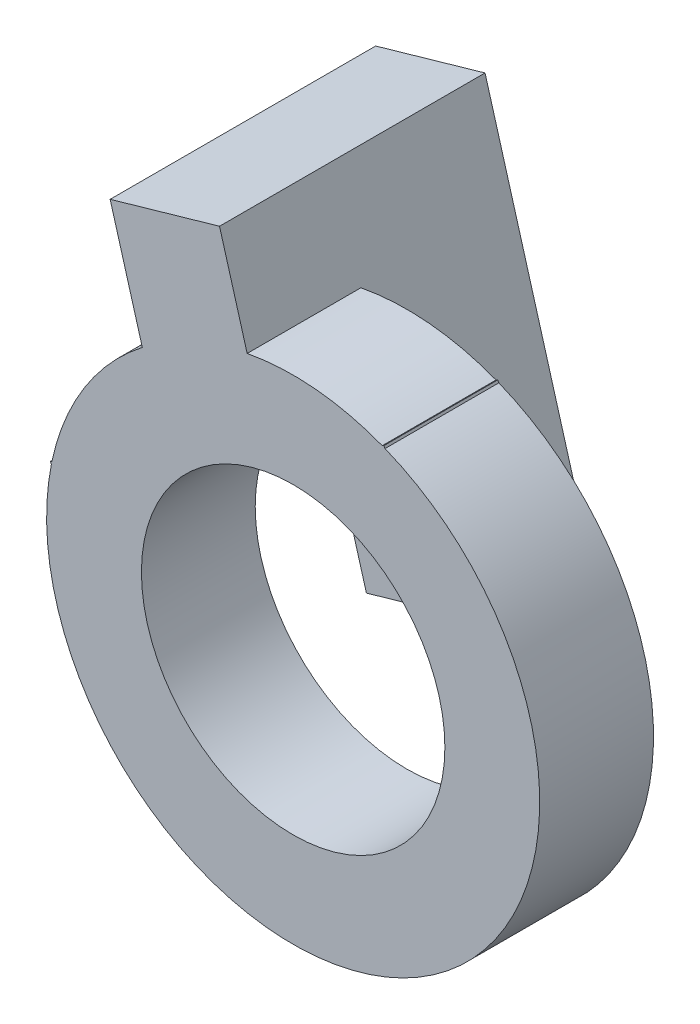
ISO-10303-21;
HEADER;
FILE_DESCRIPTION(('STEP AP214'),'2;1');
FILE_NAME('part.step','',(''),(''),'','','');
FILE_SCHEMA(('AUTOMOTIVE_DESIGN { 1 0 10303 214 1 1 1 1 }'));
ENDSEC;
DATA;
#1=APPLICATION_CONTEXT('core data for automotive mechanical design processes');
#2=APPLICATION_PROTOCOL_DEFINITION('international standard','automotive_design',2000,#1);
#3=PRODUCT_CONTEXT('',#1,'mechanical');
#4=PRODUCT('Part','Part','',(#3));
#5=PRODUCT_RELATED_PRODUCT_CATEGORY('part','',(#4));
#6=PRODUCT_DEFINITION_FORMATION('','',#4);
#7=PRODUCT_DEFINITION_CONTEXT('part definition',#1,'design');
#8=PRODUCT_DEFINITION('design','',#6,#7);
#9=PRODUCT_DEFINITION_SHAPE('','',#8);
#10=(LENGTH_UNIT() NAMED_UNIT(*) SI_UNIT(.MILLI.,.METRE.));
#11=(NAMED_UNIT(*) PLANE_ANGLE_UNIT() SI_UNIT($,.RADIAN.));
#12=(NAMED_UNIT(*) SI_UNIT($,.STERADIAN.) SOLID_ANGLE_UNIT());
#13=UNCERTAINTY_MEASURE_WITH_UNIT(LENGTH_MEASURE(1.E-05),#10,'distance_accuracy_value','');
#14=(GEOMETRIC_REPRESENTATION_CONTEXT(3) GLOBAL_UNCERTAINTY_ASSIGNED_CONTEXT((#13)) GLOBAL_UNIT_ASSIGNED_CONTEXT((#10,
#11,#12)) REPRESENTATION_CONTEXT('',''));
#15=CARTESIAN_POINT('',(0.,0.,0.));
#16=DIRECTION('',(0.,0.,1.));
#17=DIRECTION('',(1.,0.,0.));
#18=AXIS2_PLACEMENT_3D('',#15,#16,#17);
#19=CARTESIAN_POINT('',(51.308053389424,13.594933056809,57.5));
#20=DIRECTION('',(0.4757054700283,-0.879604630379555,0.));
#21=DIRECTION('',(0.,0.,-1.));
#22=AXIS2_PLACEMENT_3D('',#19,#20,#21);
#23=PLANE('',#22);
#24=DIRECTION('',(0.,0.,1.));
#25=VECTOR('',#24,1.);
#26=CARTESIAN_POINT('',(60.104099693219,18.351987757093,57.5));
#27=LINE('',#26,#25);
#28=CARTESIAN_POINT('',(60.104099693219,18.351987757093,57.5));
#29=VERTEX_POINT('',#28);
#30=CARTESIAN_POINT('',(60.104099693219,18.351987757093,60.5));
#31=VERTEX_POINT('',#30);
#32=EDGE_CURVE('E24',#29,#31,#27,.T.);
#33=ORIENTED_EDGE('',*,*,#32,.F.);
#34=DIRECTION('',(0.879604630379555,0.4757054700283,0.));
#35=VECTOR('',#34,1.);
#36=CARTESIAN_POINT('',(51.308053389424,13.594933056809,57.5));
#37=LINE('',#36,#35);
#38=CARTESIAN_POINT('',(60.059190325897,18.327699990803,57.5));
#39=VERTEX_POINT('',#38);
#40=EDGE_CURVE('E271',#39,#29,#37,.T.);
#41=ORIENTED_EDGE('',*,*,#40,.F.);
#42=DIRECTION('',(0.,0.,1.));
#43=VECTOR('',#42,1.);
#44=CARTESIAN_POINT('',(60.059190325897,18.327699990803,57.5));
#45=LINE('',#44,#43);
#46=CARTESIAN_POINT('',(60.059190325897,18.327699990803,60.5));
#47=VERTEX_POINT('',#46);
#48=EDGE_CURVE('E9',#39,#47,#45,.T.);
#49=ORIENTED_EDGE('',*,*,#48,.T.);
#50=DIRECTION('',(0.879604630379555,0.4757054700283,0.));
#51=VECTOR('',#50,1.);
#52=CARTESIAN_POINT('',(51.308053389424,13.594933056809,60.5));
#53=LINE('',#52,#51);
#54=EDGE_CURVE('E206',#47,#31,#53,.T.);
#55=ORIENTED_EDGE('',*,*,#54,.T.);
#56=EDGE_LOOP('',(#33,#41,#49,#55));
#57=FACE_BOUND('',#56,.T.);
#58=ADVANCED_FACE('F15',(#57),#23,.F.);
#59=CARTESIAN_POINT('',(57.710708443295,12.266789758248,57.5));
#60=DIRECTION('',(0.,0.,1.));
#61=DIRECTION('',(1.,0.,0.));
#62=AXIS2_PLACEMENT_3D('',#59,#60,#61);
#63=CYLINDRICAL_SURFACE('',#62,6.5);
#64=CARTESIAN_POINT('',(57.710708443295,12.266789758248,60.5));
#65=DIRECTION('',(0.,0.,1.));
#66=DIRECTION('',(1.,0.,0.));
#67=AXIS2_PLACEMENT_3D('',#64,#65,#66);
#68=CIRCLE('',#67,6.5);
#69=CARTESIAN_POINT('',(56.498263252176,18.652709947111,60.5));
#70=VERTEX_POINT('',#69);
#71=EDGE_CURVE('E211',#47,#70,#68,.T.);
#72=ORIENTED_EDGE('',*,*,#71,.F.);
#73=ORIENTED_EDGE('',*,*,#48,.F.);
#74=CARTESIAN_POINT('',(57.710708443295,12.266789758248,57.5));
#75=DIRECTION('',(0.,0.,1.));
#76=DIRECTION('',(1.,0.,0.));
#77=AXIS2_PLACEMENT_3D('',#74,#75,#76);
#78=CIRCLE('',#77,6.5);
#79=CARTESIAN_POINT('',(56.498263252177,18.652709947111,57.5));
#80=VERTEX_POINT('',#79);
#81=EDGE_CURVE('E270',#39,#80,#78,.T.);
#82=ORIENTED_EDGE('',*,*,#81,.T.);
#83=DIRECTION('',(0.,0.,1.));
#84=VECTOR('',#83,1.);
#85=CARTESIAN_POINT('',(56.498263252177,18.652709947111,57.5));
#86=LINE('',#85,#84);
#87=EDGE_CURVE('E190',#80,#70,#86,.T.);
#88=ORIENTED_EDGE('',*,*,#87,.T.);
#89=EDGE_LOOP('',(#72,#73,#82,#88));
#90=FACE_BOUND('',#89,.T.);
#91=ADVANCED_FACE('F17',(#90),#63,.T.);
#92=CARTESIAN_POINT('',(60.104099693219,18.351987757093,57.5));
#93=DIRECTION('',(0.879604630379555,0.4757054700283,0.));
#94=DIRECTION('',(0.,0.,-1.));
#95=AXIS2_PLACEMENT_3D('',#92,#93,#94);
#96=PLANE('',#95);
#97=DIRECTION('',(0.4757054700283,-0.879604630379555,0.));
#98=VECTOR('',#97,1.);
#99=CARTESIAN_POINT('',(60.104099693219,18.351987757093,57.5));
#100=LINE('',#99,#98);
#101=CARTESIAN_POINT('',(60.132978390663,18.298589514712,57.5));
#102=VERTEX_POINT('',#101);
#103=EDGE_CURVE('E203',#29,#102,#100,.T.);
#104=ORIENTED_EDGE('',*,*,#103,.F.);
#105=ORIENTED_EDGE('',*,*,#32,.T.);
#106=DIRECTION('',(0.4757054700283,-0.879604630379555,0.));
#107=VECTOR('',#106,1.);
#108=CARTESIAN_POINT('',(60.104099693219,18.351987757093,60.5));
#109=LINE('',#108,#107);
#110=CARTESIAN_POINT('',(60.132978390663,18.298589514712,60.5));
#111=VERTEX_POINT('',#110);
#112=EDGE_CURVE('E196',#31,#111,#109,.T.);
#113=ORIENTED_EDGE('',*,*,#112,.T.);
#114=DIRECTION('',(0.,0.,1.));
#115=VECTOR('',#114,1.);
#116=CARTESIAN_POINT('',(60.132978390663,18.298589514712,57.5));
#117=LINE('',#116,#115);
#118=EDGE_CURVE('E173',#102,#111,#117,.T.);
#119=ORIENTED_EDGE('',*,*,#118,.F.);
#120=EDGE_LOOP('',(#104,#105,#113,#119));
#121=FACE_BOUND('',#120,.T.);
#122=ADVANCED_FACE('F198',(#121),#96,.T.);
#123=CARTESIAN_POINT('',(58.526155864314,11.580607960985,53.5));
#124=DIRECTION('',(0.961261695938294,0.275637355817084,0.));
#125=DIRECTION('',(0.,0.,-1.));
#126=AXIS2_PLACEMENT_3D('',#123,#124,#125);
#127=PLANE('',#126);
#128=DIRECTION('',(0.,0.,1.));
#129=VECTOR('',#128,1.);
#130=CARTESIAN_POINT('',(58.526155864314,11.580607960985,53.5));
#131=LINE('',#130,#129);
#132=CARTESIAN_POINT('',(58.526155864314,11.580607960985,53.5));
#133=VERTEX_POINT('',#132);
#134=CARTESIAN_POINT('',(58.526155864314,11.580607960985,56.5));
#135=VERTEX_POINT('',#134);
#136=EDGE_CURVE('E153',#133,#135,#131,.T.);
#137=ORIENTED_EDGE('',*,*,#136,.F.);
#138=DIRECTION('',(-0.275637355817084,0.961261695938294,0.));
#139=VECTOR('',#138,1.);
#140=CARTESIAN_POINT('',(58.526155864314,11.580607960985,53.5));
#141=LINE('',#140,#139);
#142=CARTESIAN_POINT('',(55.769782306144,21.193224920368,53.5));
#143=VERTEX_POINT('',#142);
#144=EDGE_CURVE('E38',#133,#143,#141,.T.);
#145=ORIENTED_EDGE('',*,*,#144,.T.);
#146=DIRECTION('',(0.,0.,1.));
#147=VECTOR('',#146,1.);
#148=CARTESIAN_POINT('',(55.769782306144,21.193224920368,53.5));
#149=LINE('',#148,#147);
#150=CARTESIAN_POINT('',(55.769782306144,21.193224920368,60.5));
#151=VERTEX_POINT('',#150);
#152=EDGE_CURVE('E182',#143,#151,#149,.T.);
#153=ORIENTED_EDGE('',*,*,#152,.T.);
#154=DIRECTION('',(-0.275637355817084,0.961261695938294,0.));
#155=VECTOR('',#154,1.);
#156=CARTESIAN_POINT('',(58.526155864314,11.580607960985,60.5));
#157=LINE('',#156,#155);
#158=EDGE_CURVE('E235',#70,#151,#157,.T.);
#159=ORIENTED_EDGE('',*,*,#158,.F.);
#160=ORIENTED_EDGE('',*,*,#87,.F.);
#161=DIRECTION('',(-0.275637355817084,0.961261695938294,0.));
#162=VECTOR('',#161,1.);
#163=CARTESIAN_POINT('',(57.1920960519,16.233027419747,57.5));
#164=LINE('',#163,#162);
#165=CARTESIAN_POINT('',(57.1920960519,16.233027419747,57.5));
#166=VERTEX_POINT('',#165);
#167=EDGE_CURVE('E157',#166,#80,#164,.T.);
#168=ORIENTED_EDGE('',*,*,#167,.F.);
#169=DIRECTION('',(0.,0.,1.));
#170=VECTOR('',#169,1.);
#171=CARTESIAN_POINT('',(57.1920960519,16.233027419747,56.5));
#172=LINE('',#171,#170);
#173=CARTESIAN_POINT('',(57.1920960519,16.233027419747,56.5));
#174=VERTEX_POINT('',#173);
#175=EDGE_CURVE('E156',#174,#166,#172,.T.);
#176=ORIENTED_EDGE('',*,*,#175,.F.);
#177=DIRECTION('',(0.275637355817084,-0.961261695938294,0.));
#178=VECTOR('',#177,1.);
#179=CARTESIAN_POINT('',(58.404273429003,12.005662526339,56.5));
#180=LINE('',#179,#178);
#181=EDGE_CURVE('E142',#174,#135,#180,.T.);
#182=ORIENTED_EDGE('',*,*,#181,.T.);
#183=EDGE_LOOP('',(#137,#145,#153,#159,#160,#168,#176,#182));
#184=FACE_BOUND('',#183,.T.);
#185=ADVANCED_FACE('F160',(#184),#127,.T.);
#186=CARTESIAN_POINT('',(55.642370776499,10.753695893534,53.5));
#187=DIRECTION('',(0.,0.,1.));
#188=DIRECTION('',(1.,0.,0.));
#189=AXIS2_PLACEMENT_3D('',#186,#187,#188);
#190=PLANE('',#189);
#191=DIRECTION('',(0.961261695938294,0.275637355817084,0.));
#192=VECTOR('',#191,1.);
#193=CARTESIAN_POINT('',(52.885997218329,20.366312852917,53.5));
#194=LINE('',#193,#192);
#195=CARTESIAN_POINT('',(52.885997218329,20.366312852917,53.5));
#196=VERTEX_POINT('',#195);
#197=EDGE_CURVE('E155',#196,#143,#194,.T.);
#198=ORIENTED_EDGE('',*,*,#197,.T.);
#199=ORIENTED_EDGE('',*,*,#144,.F.);
#200=DIRECTION('',(0.961261695938294,0.275637355817084,0.));
#201=VECTOR('',#200,1.);
#202=CARTESIAN_POINT('',(55.642370776499,10.753695893534,53.5));
#203=LINE('',#202,#201);
#204=CARTESIAN_POINT('',(55.642370776499,10.753695893534,53.5));
#205=VERTEX_POINT('',#204);
#206=EDGE_CURVE('E176',#205,#133,#203,.T.);
#207=ORIENTED_EDGE('',*,*,#206,.F.);
#208=DIRECTION('',(-0.275637355817084,0.961261695938294,0.));
#209=VECTOR('',#208,1.);
#210=CARTESIAN_POINT('',(55.642370776499,10.753695893534,53.5));
#211=LINE('',#210,#209);
#212=EDGE_CURVE('E232',#205,#196,#211,.T.);
#213=ORIENTED_EDGE('',*,*,#212,.T.);
#214=EDGE_LOOP('',(#198,#199,#207,#213));
#215=FACE_BOUND('',#214,.T.);
#216=ADVANCED_FACE('F301',(#215),#190,.F.);
#217=CARTESIAN_POINT('',(52.885997218329,20.366312852917,53.5));
#218=DIRECTION('',(-0.275637355817084,0.961261695938294,0.));
#219=DIRECTION('',(0.,0.,1.));
#220=AXIS2_PLACEMENT_3D('',#217,#218,#219);
#221=PLANE('',#220);
#222=ORIENTED_EDGE('',*,*,#197,.F.);
#223=DIRECTION('',(0.,0.,1.));
#224=VECTOR('',#223,1.);
#225=CARTESIAN_POINT('',(52.885997218329,20.366312852917,53.5));
#226=LINE('',#225,#224);
#227=CARTESIAN_POINT('',(52.885997218329,20.366312852917,60.5));
#228=VERTEX_POINT('',#227);
#229=EDGE_CURVE('E286',#196,#228,#226,.T.);
#230=ORIENTED_EDGE('',*,*,#229,.T.);
#231=DIRECTION('',(0.961261695938294,0.275637355817084,0.));
#232=VECTOR('',#231,1.);
#233=CARTESIAN_POINT('',(52.885997218329,20.366312852917,60.5));
#234=LINE('',#233,#232);
#235=EDGE_CURVE('E240',#228,#151,#234,.T.);
#236=ORIENTED_EDGE('',*,*,#235,.T.);
#237=ORIENTED_EDGE('',*,*,#152,.F.);
#238=EDGE_LOOP('',(#222,#230,#236,#237));
#239=FACE_BOUND('',#238,.T.);
#240=ADVANCED_FACE('F309',(#239),#221,.T.);
#241=CARTESIAN_POINT('',(57.710708443295,12.266789758248,56.5));
#242=DIRECTION('',(0.,0.,1.));
#243=DIRECTION('',(1.,0.,0.));
#244=AXIS2_PLACEMENT_3D('',#241,#242,#243);
#245=PLANE('',#244);
#246=ORIENTED_EDGE('',*,*,#181,.F.);
#247=CARTESIAN_POINT('',(57.710708443295,12.266789758248,56.5));
#248=DIRECTION('',(0.,0.,1.));
#249=DIRECTION('',(1.,0.,0.));
#250=AXIS2_PLACEMENT_3D('',#247,#248,#249);
#251=CIRCLE('',#250,4.);
#252=CARTESIAN_POINT('',(54.517659554943,14.676030052738,56.5));
#253=VERTEX_POINT('',#252);
#254=EDGE_CURVE('E150',#174,#253,#251,.T.);
#255=ORIENTED_EDGE('',*,*,#254,.T.);
#256=DIRECTION('',(0.275637355817084,-0.961261695938294,0.));
#257=VECTOR('',#256,1.);
#258=CARTESIAN_POINT('',(55.520488341188,11.178750458888,56.5));
#259=LINE('',#258,#257);
#260=CARTESIAN_POINT('',(55.642370776499,10.753695893534,56.5));
#261=VERTEX_POINT('',#260);
#262=EDGE_CURVE('E283',#253,#261,#259,.T.);
#263=ORIENTED_EDGE('',*,*,#262,.T.);
#264=DIRECTION('',(0.961261695938294,0.275637355817084,0.));
#265=VECTOR('',#264,1.);
#266=CARTESIAN_POINT('',(56.798422045208,11.085188260537,56.5));
#267=LINE('',#266,#265);
#268=EDGE_CURVE('E149',#261,#135,#267,.T.);
#269=ORIENTED_EDGE('',*,*,#268,.T.);
#270=EDGE_LOOP('',(#246,#255,#263,#269));
#271=FACE_BOUND('',#270,.T.);
#272=ADVANCED_FACE('F145',(#271),#245,.T.);
#273=CARTESIAN_POINT('',(55.642370776499,10.753695893534,53.5));
#274=DIRECTION('',(-0.275637355817084,0.961261695938294,0.));
#275=DIRECTION('',(0.,0.,1.));
#276=AXIS2_PLACEMENT_3D('',#273,#274,#275);
#277=PLANE('',#276);
#278=ORIENTED_EDGE('',*,*,#268,.F.);
#279=DIRECTION('',(0.,0.,1.));
#280=VECTOR('',#279,1.);
#281=CARTESIAN_POINT('',(55.642370776499,10.753695893534,53.5));
#282=LINE('',#281,#280);
#283=EDGE_CURVE('E227',#205,#261,#282,.T.);
#284=ORIENTED_EDGE('',*,*,#283,.F.);
#285=ORIENTED_EDGE('',*,*,#206,.T.);
#286=ORIENTED_EDGE('',*,*,#136,.T.);
#287=EDGE_LOOP('',(#278,#284,#285,#286));
#288=FACE_BOUND('',#287,.T.);
#289=ADVANCED_FACE('F385',(#288),#277,.F.);
#290=CARTESIAN_POINT('',(57.710708443295,12.266789758248,56.5));
#291=DIRECTION('',(0.,0.,1.));
#292=DIRECTION('',(1.,0.,0.));
#293=AXIS2_PLACEMENT_3D('',#290,#291,#292);
#294=CYLINDRICAL_SURFACE('',#293,4.);
#295=DIRECTION('',(0.,0.,1.));
#296=VECTOR('',#295,1.);
#297=CARTESIAN_POINT('',(61.710708443295,12.266789758248,56.5));
#298=LINE('',#297,#296);
#299=CARTESIAN_POINT('',(61.710708443295,12.266789758248,57.5));
#300=VERTEX_POINT('',#299);
#301=CARTESIAN_POINT('',(61.710708443295,12.266789758248,60.5));
#302=VERTEX_POINT('',#301);
#303=EDGE_CURVE('E168',#300,#302,#298,.T.);
#304=ORIENTED_EDGE('',*,*,#303,.F.);
#305=CARTESIAN_POINT('',(57.710708443295,12.266789758248,57.5));
#306=DIRECTION('',(0.,0.,1.));
#307=DIRECTION('',(-0.798262222087755,0.602310073622815,0.));
#308=AXIS2_PLACEMENT_3D('',#305,#306,#307);
#309=CIRCLE('',#308,4.);
#310=CARTESIAN_POINT('',(54.517659554943,14.676030052738,57.5));
#311=VERTEX_POINT('',#310);
#312=EDGE_CURVE('E241',#311,#300,#309,.T.);
#313=ORIENTED_EDGE('',*,*,#312,.F.);
#314=DIRECTION('',(0.,0.,1.));
#315=VECTOR('',#314,1.);
#316=CARTESIAN_POINT('',(54.517659554943,14.676030052738,56.5));
#317=LINE('',#316,#315);
#318=EDGE_CURVE('E170',#253,#311,#317,.T.);
#319=ORIENTED_EDGE('',*,*,#318,.F.);
#320=ORIENTED_EDGE('',*,*,#254,.F.);
#321=ORIENTED_EDGE('',*,*,#175,.T.);
#322=CARTESIAN_POINT('',(57.710708443295,12.266789758248,57.5));
#323=DIRECTION('',(0.,0.,1.));
#324=DIRECTION('',(1.,0.,0.));
#325=AXIS2_PLACEMENT_3D('',#322,#323,#324);
#326=CIRCLE('',#325,4.);
#327=EDGE_CURVE('E265',#300,#166,#326,.T.);
#328=ORIENTED_EDGE('',*,*,#327,.F.);
#329=ORIENTED_EDGE('',*,*,#303,.T.);
#330=CARTESIAN_POINT('',(57.710708443295,12.266789758248,60.5));
#331=DIRECTION('',(0.,0.,-1.));
#332=DIRECTION('',(1.,0.,0.));
#333=AXIS2_PLACEMENT_3D('',#330,#331,#332);
#334=CIRCLE('',#333,4.);
#335=EDGE_CURVE('E250',#302,#302,#334,.T.);
#336=ORIENTED_EDGE('',*,*,#335,.F.);
#337=EDGE_LOOP('',(#304,#313,#319,#320,#321,#328,#329,#336));
#338=FACE_BOUND('',#337,.T.);
#339=ADVANCED_FACE('F164',(#338),#294,.F.);
#340=CARTESIAN_POINT('',(57.710708443295,12.266789758248,57.5));
#341=DIRECTION('',(0.,0.,1.));
#342=DIRECTION('',(1.,0.,0.));
#343=AXIS2_PLACEMENT_3D('',#340,#341,#342);
#344=CYLINDRICAL_SURFACE('',#343,6.5);
#345=CARTESIAN_POINT('',(57.710708443295,12.266789758248,57.5));
#346=DIRECTION('',(0.,0.,-1.));
#347=DIRECTION('',(0.372656914980005,0.927969193302011,0.));
#348=AXIS2_PLACEMENT_3D('',#345,#346,#347);
#349=CIRCLE('',#348,6.5);
#350=CARTESIAN_POINT('',(51.336932086868,13.541534814428,57.5));
#351=VERTEX_POINT('',#350);
#352=EDGE_CURVE('E277',#102,#351,#349,.T.);
#353=ORIENTED_EDGE('',*,*,#352,.F.);
#354=ORIENTED_EDGE('',*,*,#118,.T.);
#355=CARTESIAN_POINT('',(57.710708443295,12.266789758248,60.5));
#356=DIRECTION('',(0.,0.,1.));
#357=DIRECTION('',(-0.980580977911756,0.196114624027951,0.));
#358=AXIS2_PLACEMENT_3D('',#355,#356,#357);
#359=CIRCLE('',#358,6.5);
#360=CARTESIAN_POINT('',(51.336932086868,13.541534814428,60.5));
#361=VERTEX_POINT('',#360);
#362=EDGE_CURVE('E220',#361,#111,#359,.T.);
#363=ORIENTED_EDGE('',*,*,#362,.F.);
#364=DIRECTION('',(0.,0.,1.));
#365=VECTOR('',#364,1.);
#366=CARTESIAN_POINT('',(51.336932086868,13.541534814427,57.5));
#367=LINE('',#366,#365);
#368=EDGE_CURVE('E281',#351,#361,#367,.T.);
#369=ORIENTED_EDGE('',*,*,#368,.F.);
#370=EDGE_LOOP('',(#353,#354,#363,#369));
#371=FACE_BOUND('',#370,.T.);
#372=ADVANCED_FACE('F357',(#371),#344,.T.);
#373=CARTESIAN_POINT('',(55.642370776499,10.753695893534,53.5));
#374=DIRECTION('',(0.961261695938294,0.275637355817084,0.));
#375=DIRECTION('',(0.,0.,-1.));
#376=AXIS2_PLACEMENT_3D('',#373,#374,#375);
#377=PLANE('',#376);
#378=ORIENTED_EDGE('',*,*,#262,.F.);
#379=ORIENTED_EDGE('',*,*,#318,.T.);
#380=DIRECTION('',(0.275637355817084,-0.961261695938294,0.));
#381=VECTOR('',#380,1.);
#382=CARTESIAN_POINT('',(53.734143466778,17.408475375586,57.5));
#383=LINE('',#382,#381);
#384=CARTESIAN_POINT('',(53.734143466778,17.408475375586,57.5));
#385=VERTEX_POINT('',#384);
#386=EDGE_CURVE('E236',#385,#311,#383,.T.);
#387=ORIENTED_EDGE('',*,*,#386,.F.);
#388=DIRECTION('',(0.,0.,1.));
#389=VECTOR('',#388,1.);
#390=CARTESIAN_POINT('',(53.734143466778,17.408475375586,57.5));
#391=LINE('',#390,#389);
#392=CARTESIAN_POINT('',(53.734143466778,17.408475375586,60.5));
#393=VERTEX_POINT('',#392);
#394=EDGE_CURVE('E253',#385,#393,#391,.T.);
#395=ORIENTED_EDGE('',*,*,#394,.T.);
#396=DIRECTION('',(-0.275637355817084,0.961261695938294,0.));
#397=VECTOR('',#396,1.);
#398=CARTESIAN_POINT('',(55.642370776499,10.753695893534,60.5));
#399=LINE('',#398,#397);
#400=EDGE_CURVE('E246',#393,#228,#399,.T.);
#401=ORIENTED_EDGE('',*,*,#400,.T.);
#402=ORIENTED_EDGE('',*,*,#229,.F.);
#403=ORIENTED_EDGE('',*,*,#212,.F.);
#404=ORIENTED_EDGE('',*,*,#283,.T.);
#405=EDGE_LOOP('',(#378,#379,#387,#395,#401,#402,#403,#404));
#406=FACE_BOUND('',#405,.T.);
#407=ADVANCED_FACE('F308',(#406),#377,.F.);
#408=CARTESIAN_POINT('',(51.308053389424,13.594933056809,57.5));
#409=DIRECTION('',(0.879604630379555,0.4757054700283,0.));
#410=DIRECTION('',(0.,0.,-1.));
#411=AXIS2_PLACEMENT_3D('',#408,#409,#410);
#412=PLANE('',#411);
#413=ORIENTED_EDGE('',*,*,#368,.T.);
#414=DIRECTION('',(0.4757054700283,-0.879604630379555,0.));
#415=VECTOR('',#414,1.);
#416=CARTESIAN_POINT('',(51.308053389424,13.594933056809,60.5));
#417=LINE('',#416,#415);
#418=CARTESIAN_POINT('',(51.308053389424,13.594933056809,60.5));
#419=VERTEX_POINT('',#418);
#420=EDGE_CURVE('E224',#419,#361,#417,.T.);
#421=ORIENTED_EDGE('',*,*,#420,.F.);
#422=DIRECTION('',(0.,0.,1.));
#423=VECTOR('',#422,1.);
#424=CARTESIAN_POINT('',(51.308053389424,13.594933056809,57.5));
#425=LINE('',#424,#423);
#426=CARTESIAN_POINT('',(51.308053389424,13.594933056809,57.5));
#427=VERTEX_POINT('',#426);
#428=EDGE_CURVE('E344',#427,#419,#425,.T.);
#429=ORIENTED_EDGE('',*,*,#428,.F.);
#430=DIRECTION('',(0.4757054700283,-0.879604630379555,0.));
#431=VECTOR('',#430,1.);
#432=CARTESIAN_POINT('',(51.308053389424,13.594933056809,57.5));
#433=LINE('',#432,#431);
#434=EDGE_CURVE('E280',#427,#351,#433,.T.);
#435=ORIENTED_EDGE('',*,*,#434,.T.);
#436=EDGE_LOOP('',(#413,#421,#429,#435));
#437=FACE_BOUND('',#436,.T.);
#438=ADVANCED_FACE('F353',(#437),#412,.F.);
#439=CARTESIAN_POINT('',(51.308053389424,13.594933056809,57.5));
#440=DIRECTION('',(0.,0.,1.));
#441=DIRECTION('',(1.,0.,0.));
#442=AXIS2_PLACEMENT_3D('',#439,#440,#441);
#443=PLANE('',#442);
#444=CARTESIAN_POINT('',(57.710708443295,12.266789758248,57.5));
#445=DIRECTION('',(0.,0.,1.));
#446=DIRECTION('',(1.,0.,0.));
#447=AXIS2_PLACEMENT_3D('',#444,#445,#446);
#448=CIRCLE('',#447,6.5);
#449=CARTESIAN_POINT('',(51.352962756746,13.619220823099,57.5));
#450=VERTEX_POINT('',#449);
#451=EDGE_CURVE('E245',#385,#450,#448,.T.);
#452=ORIENTED_EDGE('',*,*,#451,.F.);
#453=ORIENTED_EDGE('',*,*,#386,.T.);
#454=ORIENTED_EDGE('',*,*,#312,.T.);
#455=ORIENTED_EDGE('',*,*,#327,.T.);
#456=ORIENTED_EDGE('',*,*,#167,.T.);
#457=ORIENTED_EDGE('',*,*,#81,.F.);
#458=ORIENTED_EDGE('',*,*,#40,.T.);
#459=ORIENTED_EDGE('',*,*,#103,.T.);
#460=ORIENTED_EDGE('',*,*,#352,.T.);
#461=ORIENTED_EDGE('',*,*,#434,.F.);
#462=DIRECTION('',(0.879604630379555,0.4757054700283,0.));
#463=VECTOR('',#462,1.);
#464=CARTESIAN_POINT('',(51.308053389424,13.594933056809,57.5));
#465=LINE('',#464,#463);
#466=EDGE_CURVE('E346',#427,#450,#465,.T.);
#467=ORIENTED_EDGE('',*,*,#466,.T.);
#468=EDGE_LOOP('',(#452,#453,#454,#455,#456,#457,#458,#459,#460,#461,#467));
#469=FACE_BOUND('',#468,.T.);
#470=ADVANCED_FACE('F363',(#469),#443,.F.);
#471=CARTESIAN_POINT('',(57.710708443295,12.266789758248,57.5));
#472=DIRECTION('',(0.,0.,1.));
#473=DIRECTION('',(1.,0.,0.));
#474=AXIS2_PLACEMENT_3D('',#471,#472,#473);
#475=CYLINDRICAL_SURFACE('',#474,6.5);
#476=CARTESIAN_POINT('',(57.710708443295,12.266789758248,60.5));
#477=DIRECTION('',(0.,0.,1.));
#478=DIRECTION('',(1.,0.,0.));
#479=AXIS2_PLACEMENT_3D('',#476,#477,#478);
#480=CIRCLE('',#479,6.5);
#481=CARTESIAN_POINT('',(51.352962756746,13.619220823099,60.5));
#482=VERTEX_POINT('',#481);
#483=EDGE_CURVE('E252',#393,#482,#480,.T.);
#484=ORIENTED_EDGE('',*,*,#483,.F.);
#485=ORIENTED_EDGE('',*,*,#394,.F.);
#486=ORIENTED_EDGE('',*,*,#451,.T.);
#487=DIRECTION('',(0.,0.,1.));
#488=VECTOR('',#487,1.);
#489=CARTESIAN_POINT('',(51.352962756746,13.619220823099,57.5));
#490=LINE('',#489,#488);
#491=EDGE_CURVE('E332',#450,#482,#490,.T.);
#492=ORIENTED_EDGE('',*,*,#491,.T.);
#493=EDGE_LOOP('',(#484,#485,#486,#492));
#494=FACE_BOUND('',#493,.T.);
#495=ADVANCED_FACE('F328',(#494),#475,.T.);
#496=CARTESIAN_POINT('',(51.308053389424,13.594933056809,60.5));
#497=DIRECTION('',(0.,0.,1.));
#498=DIRECTION('',(1.,0.,0.));
#499=AXIS2_PLACEMENT_3D('',#496,#497,#498);
#500=PLANE('',#499);
#501=ORIENTED_EDGE('',*,*,#335,.T.);
#502=EDGE_LOOP('',(#501));
#503=FACE_BOUND('',#502,.T.);
#504=DIRECTION('',(0.879604630379555,0.4757054700283,0.));
#505=VECTOR('',#504,1.);
#506=CARTESIAN_POINT('',(51.308053389424,13.594933056809,60.5));
#507=LINE('',#506,#505);
#508=EDGE_CURVE('E350',#419,#482,#507,.T.);
#509=ORIENTED_EDGE('',*,*,#508,.F.);
#510=ORIENTED_EDGE('',*,*,#420,.T.);
#511=ORIENTED_EDGE('',*,*,#362,.T.);
#512=ORIENTED_EDGE('',*,*,#112,.F.);
#513=ORIENTED_EDGE('',*,*,#54,.F.);
#514=ORIENTED_EDGE('',*,*,#71,.T.);
#515=ORIENTED_EDGE('',*,*,#158,.T.);
#516=ORIENTED_EDGE('',*,*,#235,.F.);
#517=ORIENTED_EDGE('',*,*,#400,.F.);
#518=ORIENTED_EDGE('',*,*,#483,.T.);
#519=EDGE_LOOP('',(#509,#510,#511,#512,#513,#514,#515,#516,#517,#518));
#520=FACE_BOUND('',#519,.T.);
#521=ADVANCED_FACE('F212',(#503,#520),#500,.T.);
#522=CARTESIAN_POINT('',(51.308053389424,13.594933056809,57.5));
#523=DIRECTION('',(0.4757054700283,-0.879604630379555,0.));
#524=DIRECTION('',(0.,0.,-1.));
#525=AXIS2_PLACEMENT_3D('',#522,#523,#524);
#526=PLANE('',#525);
#527=ORIENTED_EDGE('',*,*,#491,.F.);
#528=ORIENTED_EDGE('',*,*,#466,.F.);
#529=ORIENTED_EDGE('',*,*,#428,.T.);
#530=ORIENTED_EDGE('',*,*,#508,.T.);
#531=EDGE_LOOP('',(#527,#528,#529,#530));
#532=FACE_BOUND('',#531,.T.);
#533=ADVANCED_FACE('F378',(#532),#526,.F.);
#534=CLOSED_SHELL('',(#58,#91,#122,#185,#216,#240,#272,#289,#339,#372,#407,#438,#470,#495,#521,#533));
#535=MANIFOLD_SOLID_BREP('B1',#534);
#536=ADVANCED_BREP_SHAPE_REPRESENTATION('',(#18,#535),#14);
#537=SHAPE_DEFINITION_REPRESENTATION(#9,#536);
ENDSEC;
END-ISO-10303-21;
